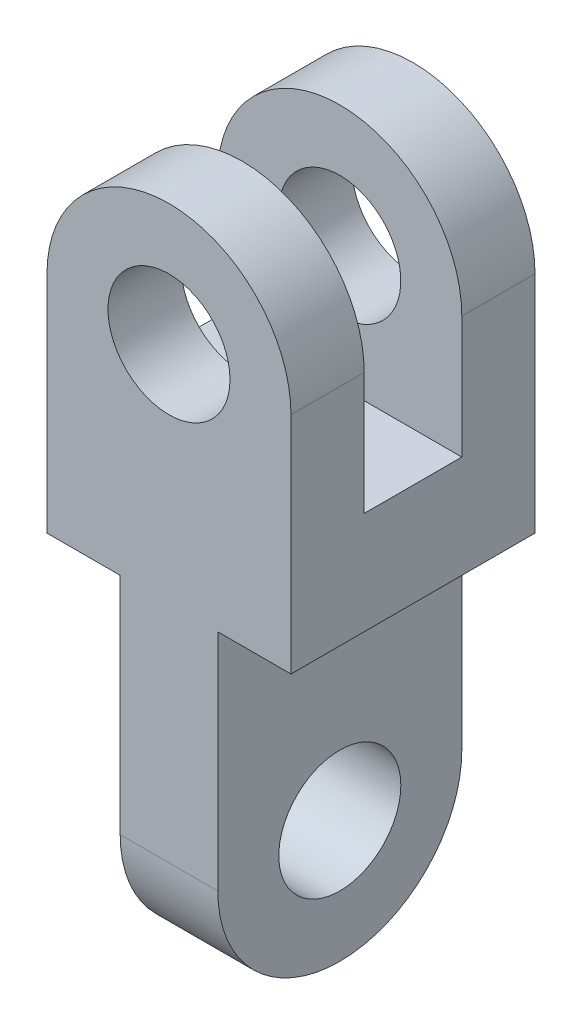
ISO-10303-21;
HEADER;
FILE_DESCRIPTION(('STEP AP214'),'2;1');
FILE_NAME('part.step','',(''),(''),'','','');
FILE_SCHEMA(('AUTOMOTIVE_DESIGN { 1 0 10303 214 1 1 1 1 }'));
ENDSEC;
DATA;
#1=APPLICATION_CONTEXT('core data for automotive mechanical design processes');
#2=APPLICATION_PROTOCOL_DEFINITION('international standard','automotive_design',2000,#1);
#3=PRODUCT_CONTEXT('',#1,'mechanical');
#4=PRODUCT('Part','Part','',(#3));
#5=PRODUCT_RELATED_PRODUCT_CATEGORY('part','',(#4));
#6=PRODUCT_DEFINITION_FORMATION('','',#4);
#7=PRODUCT_DEFINITION_CONTEXT('part definition',#1,'design');
#8=PRODUCT_DEFINITION('design','',#6,#7);
#9=PRODUCT_DEFINITION_SHAPE('','',#8);
#10=(LENGTH_UNIT() NAMED_UNIT(*) SI_UNIT(.MILLI.,.METRE.));
#11=(NAMED_UNIT(*) PLANE_ANGLE_UNIT() SI_UNIT($,.RADIAN.));
#12=(NAMED_UNIT(*) SI_UNIT($,.STERADIAN.) SOLID_ANGLE_UNIT());
#13=UNCERTAINTY_MEASURE_WITH_UNIT(LENGTH_MEASURE(1.E-05),#10,'distance_accuracy_value','');
#14=(GEOMETRIC_REPRESENTATION_CONTEXT(3) GLOBAL_UNCERTAINTY_ASSIGNED_CONTEXT((#13)) GLOBAL_UNIT_ASSIGNED_CONTEXT((#10,
#11,#12)) REPRESENTATION_CONTEXT('',''));
#15=CARTESIAN_POINT('',(0.,0.,0.));
#16=DIRECTION('',(0.,0.,1.));
#17=DIRECTION('',(1.,0.,0.));
#18=AXIS2_PLACEMENT_3D('',#15,#16,#17);
#19=CARTESIAN_POINT('',(0.,-92.,-30.));
#20=DIRECTION('',(0.,-1.,0.));
#21=DIRECTION('',(0.,0.,-1.));
#22=AXIS2_PLACEMENT_3D('',#19,#20,#21);
#23=PLANE('',#22);
#24=DIRECTION('',(-1.,0.,0.));
#25=VECTOR('',#24,1.);
#26=CARTESIAN_POINT('',(50.,-92.,-100.));
#27=LINE('',#26,#25);
#28=CARTESIAN_POINT('',(-20.,-92.,-100.));
#29=VERTEX_POINT('',#28);
#30=CARTESIAN_POINT('',(-50.,-92.,-100.));
#31=VERTEX_POINT('',#30);
#32=EDGE_CURVE('E188',#29,#31,#27,.T.);
#33=ORIENTED_EDGE('',*,*,#32,.F.);
#34=DIRECTION('',(0.,0.,1.));
#35=VECTOR('',#34,1.);
#36=CARTESIAN_POINT('',(-20.,-92.,0.));
#37=LINE('',#36,#35);
#38=CARTESIAN_POINT('',(-20.,-92.,0.));
#39=VERTEX_POINT('',#38);
#40=EDGE_CURVE('E172',#29,#39,#37,.T.);
#41=ORIENTED_EDGE('',*,*,#40,.T.);
#42=DIRECTION('',(1.,0.,0.));
#43=VECTOR('',#42,1.);
#44=CARTESIAN_POINT('',(0.,-92.,0.));
#45=LINE('',#44,#43);
#46=CARTESIAN_POINT('',(-50.,-92.,0.));
#47=VERTEX_POINT('',#46);
#48=EDGE_CURVE('E219',#47,#39,#45,.T.);
#49=ORIENTED_EDGE('',*,*,#48,.F.);
#50=DIRECTION('',(0.,0.,1.));
#51=VECTOR('',#50,1.);
#52=CARTESIAN_POINT('',(-50.,-92.,-30.));
#53=LINE('',#52,#51);
#54=EDGE_CURVE('E47',#31,#47,#53,.T.);
#55=ORIENTED_EDGE('',*,*,#54,.F.);
#56=EDGE_LOOP('',(#33,#41,#49,#55));
#57=FACE_BOUND('',#56,.T.);
#58=ADVANCED_FACE('F38',(#57),#23,.T.);
#59=CARTESIAN_POINT('',(0.,0.,-30.));
#60=DIRECTION('',(0.,0.,1.));
#61=DIRECTION('',(1.,0.,0.));
#62=AXIS2_PLACEMENT_3D('',#59,#60,#61);
#63=PLANE('',#62);
#64=CARTESIAN_POINT('',(0.,0.,-30.));
#65=DIRECTION('',(0.,0.,1.));
#66=DIRECTION('',(1.,0.,0.));
#67=AXIS2_PLACEMENT_3D('',#64,#65,#66);
#68=CIRCLE('',#67,25.);
#69=CARTESIAN_POINT('',(25.,0.,-30.));
#70=VERTEX_POINT('',#69);
#71=EDGE_CURVE('E215',#70,#70,#68,.T.);
#72=ORIENTED_EDGE('',*,*,#71,.T.);
#73=EDGE_LOOP('',(#72));
#74=FACE_BOUND('',#73,.T.);
#75=DIRECTION('',(1.,0.,0.));
#76=VECTOR('',#75,1.);
#77=CARTESIAN_POINT('',(50.,-50.,-30.));
#78=LINE('',#77,#76);
#79=CARTESIAN_POINT('',(-50.,-50.,-30.));
#80=VERTEX_POINT('',#79);
#81=CARTESIAN_POINT('',(50.,-50.,-30.));
#82=VERTEX_POINT('',#81);
#83=EDGE_CURVE('E63',#80,#82,#78,.T.);
#84=ORIENTED_EDGE('',*,*,#83,.F.);
#85=DIRECTION('',(0.,-1.,0.));
#86=VECTOR('',#85,1.);
#87=CARTESIAN_POINT('',(-50.,0.,-30.));
#88=LINE('',#87,#86);
#89=CARTESIAN_POINT('',(-50.,0.,-30.));
#90=VERTEX_POINT('',#89);
#91=EDGE_CURVE('E224',#90,#80,#88,.T.);
#92=ORIENTED_EDGE('',*,*,#91,.F.);
#93=CARTESIAN_POINT('',(0.,0.,-30.));
#94=DIRECTION('',(0.,0.,1.));
#95=DIRECTION('',(1.,0.,0.));
#96=AXIS2_PLACEMENT_3D('',#93,#94,#95);
#97=CIRCLE('',#96,50.);
#98=CARTESIAN_POINT('',(50.,0.,-30.));
#99=VERTEX_POINT('',#98);
#100=EDGE_CURVE('E221',#99,#90,#97,.T.);
#101=ORIENTED_EDGE('',*,*,#100,.F.);
#102=DIRECTION('',(0.,1.,0.));
#103=VECTOR('',#102,1.);
#104=CARTESIAN_POINT('',(50.,0.,-30.));
#105=LINE('',#104,#103);
#106=EDGE_CURVE('E218',#82,#99,#105,.T.);
#107=ORIENTED_EDGE('',*,*,#106,.F.);
#108=EDGE_LOOP('',(#84,#92,#101,#107));
#109=FACE_BOUND('',#108,.T.);
#110=ADVANCED_FACE('F270',(#74,#109),#63,.F.);
#111=CARTESIAN_POINT('',(50.,0.,-30.));
#112=DIRECTION('',(1.,0.,0.));
#113=DIRECTION('',(0.,1.,0.));
#114=AXIS2_PLACEMENT_3D('',#111,#112,#113);
#115=PLANE('',#114);
#116=DIRECTION('',(0.,1.,0.));
#117=VECTOR('',#116,1.);
#118=CARTESIAN_POINT('',(50.,0.,0.));
#119=LINE('',#118,#117);
#120=CARTESIAN_POINT('',(50.,-92.,0.));
#121=VERTEX_POINT('',#120);
#122=CARTESIAN_POINT('',(50.,0.,0.));
#123=VERTEX_POINT('',#122);
#124=EDGE_CURVE('E228',#121,#123,#119,.T.);
#125=ORIENTED_EDGE('',*,*,#124,.F.);
#126=DIRECTION('',(0.,0.,1.));
#127=VECTOR('',#126,1.);
#128=CARTESIAN_POINT('',(50.,-92.,-30.));
#129=LINE('',#128,#127);
#130=CARTESIAN_POINT('',(50.,-92.,-100.));
#131=VERTEX_POINT('',#130);
#132=EDGE_CURVE('E11',#131,#121,#129,.T.);
#133=ORIENTED_EDGE('',*,*,#132,.F.);
#134=DIRECTION('',(0.,-1.,0.));
#135=VECTOR('',#134,1.);
#136=CARTESIAN_POINT('',(50.,0.,-100.));
#137=LINE('',#136,#135);
#138=CARTESIAN_POINT('',(50.,0.,-100.));
#139=VERTEX_POINT('',#138);
#140=EDGE_CURVE('E185',#139,#131,#137,.T.);
#141=ORIENTED_EDGE('',*,*,#140,.F.);
#142=DIRECTION('',(0.,0.,1.));
#143=VECTOR('',#142,1.);
#144=CARTESIAN_POINT('',(50.,0.,-100.));
#145=LINE('',#144,#143);
#146=CARTESIAN_POINT('',(50.,0.,-70.));
#147=VERTEX_POINT('',#146);
#148=EDGE_CURVE('E201',#139,#147,#145,.T.);
#149=ORIENTED_EDGE('',*,*,#148,.T.);
#150=DIRECTION('',(0.,-1.,0.));
#151=VECTOR('',#150,1.);
#152=CARTESIAN_POINT('',(50.,0.,-70.));
#153=LINE('',#152,#151);
#154=CARTESIAN_POINT('',(50.,-50.,-70.));
#155=VERTEX_POINT('',#154);
#156=EDGE_CURVE('E195',#147,#155,#153,.T.);
#157=ORIENTED_EDGE('',*,*,#156,.T.);
#158=DIRECTION('',(0.,0.,1.));
#159=VECTOR('',#158,1.);
#160=CARTESIAN_POINT('',(50.,-50.,-70.));
#161=LINE('',#160,#159);
#162=EDGE_CURVE('E207',#155,#82,#161,.T.);
#163=ORIENTED_EDGE('',*,*,#162,.T.);
#164=ORIENTED_EDGE('',*,*,#106,.T.);
#165=DIRECTION('',(0.,0.,1.));
#166=VECTOR('',#165,1.);
#167=CARTESIAN_POINT('',(50.,0.,-30.));
#168=LINE('',#167,#166);
#169=EDGE_CURVE('E42',#99,#123,#168,.T.);
#170=ORIENTED_EDGE('',*,*,#169,.T.);
#171=EDGE_LOOP('',(#125,#133,#141,#149,#157,#163,#164,#170));
#172=FACE_BOUND('',#171,.T.);
#173=ADVANCED_FACE('F247',(#172),#115,.T.);
#174=DIRECTION('',(0.,0.,1.));
#175=VECTOR('',#174,1.);
#176=CARTESIAN_POINT('',(20.,-92.,0.));
#177=LINE('',#176,#175);
#178=CARTESIAN_POINT('',(20.,-92.,-100.));
#179=VERTEX_POINT('',#178);
#180=CARTESIAN_POINT('',(20.,-92.,0.));
#181=VERTEX_POINT('',#180);
#182=EDGE_CURVE('E152',#179,#181,#177,.T.);
#183=ORIENTED_EDGE('',*,*,#182,.F.);
#184=EDGE_CURVE('E149',#131,#179,#27,.T.);
#185=ORIENTED_EDGE('',*,*,#184,.F.);
#186=ORIENTED_EDGE('',*,*,#132,.T.);
#187=EDGE_CURVE('E237',#181,#121,#45,.T.);
#188=ORIENTED_EDGE('',*,*,#187,.F.);
#189=EDGE_LOOP('',(#183,#185,#186,#188));
#190=FACE_BOUND('',#189,.T.);
#191=ADVANCED_FACE('F254',(#190),#23,.T.);
#192=CARTESIAN_POINT('',(-50.,0.,-30.));
#193=DIRECTION('',(-1.,0.,0.));
#194=DIRECTION('',(0.,-1.,0.));
#195=AXIS2_PLACEMENT_3D('',#192,#193,#194);
#196=PLANE('',#195);
#197=DIRECTION('',(0.,-1.,0.));
#198=VECTOR('',#197,1.);
#199=CARTESIAN_POINT('',(-50.,0.,0.));
#200=LINE('',#199,#198);
#201=CARTESIAN_POINT('',(-50.,0.,0.));
#202=VERTEX_POINT('',#201);
#203=EDGE_CURVE('E234',#202,#47,#200,.T.);
#204=ORIENTED_EDGE('',*,*,#203,.F.);
#205=DIRECTION('',(0.,0.,1.));
#206=VECTOR('',#205,1.);
#207=CARTESIAN_POINT('',(-50.,0.,-30.));
#208=LINE('',#207,#206);
#209=EDGE_CURVE('E240',#90,#202,#208,.T.);
#210=ORIENTED_EDGE('',*,*,#209,.F.);
#211=ORIENTED_EDGE('',*,*,#91,.T.);
#212=DIRECTION('',(0.,0.,1.));
#213=VECTOR('',#212,1.);
#214=CARTESIAN_POINT('',(-50.,-50.,-70.));
#215=LINE('',#214,#213);
#216=CARTESIAN_POINT('',(-50.,-50.,-70.));
#217=VERTEX_POINT('',#216);
#218=EDGE_CURVE('E211',#217,#80,#215,.T.);
#219=ORIENTED_EDGE('',*,*,#218,.F.);
#220=DIRECTION('',(0.,1.,0.));
#221=VECTOR('',#220,1.);
#222=CARTESIAN_POINT('',(-50.,-92.,-70.));
#223=LINE('',#222,#221);
#224=CARTESIAN_POINT('',(-50.,0.,-70.));
#225=VERTEX_POINT('',#224);
#226=EDGE_CURVE('E186',#217,#225,#223,.T.);
#227=ORIENTED_EDGE('',*,*,#226,.T.);
#228=DIRECTION('',(0.,0.,1.));
#229=VECTOR('',#228,1.);
#230=CARTESIAN_POINT('',(-50.,0.,-100.));
#231=LINE('',#230,#229);
#232=CARTESIAN_POINT('',(-50.,0.,-100.));
#233=VERTEX_POINT('',#232);
#234=EDGE_CURVE('E192',#233,#225,#231,.T.);
#235=ORIENTED_EDGE('',*,*,#234,.F.);
#236=DIRECTION('',(0.,1.,0.));
#237=VECTOR('',#236,1.);
#238=CARTESIAN_POINT('',(-50.,-92.,-100.));
#239=LINE('',#238,#237);
#240=EDGE_CURVE('E190',#31,#233,#239,.T.);
#241=ORIENTED_EDGE('',*,*,#240,.F.);
#242=ORIENTED_EDGE('',*,*,#54,.T.);
#243=EDGE_LOOP('',(#204,#210,#211,#219,#227,#235,#241,#242));
#244=FACE_BOUND('',#243,.T.);
#245=ADVANCED_FACE('F269',(#244),#196,.T.);
#246=CARTESIAN_POINT('',(0.,0.,-30.));
#247=DIRECTION('',(0.,0.,1.));
#248=DIRECTION('',(1.,0.,0.));
#249=AXIS2_PLACEMENT_3D('',#246,#247,#248);
#250=CYLINDRICAL_SURFACE('',#249,25.);
#251=ORIENTED_EDGE('',*,*,#71,.F.);
#252=EDGE_LOOP('',(#251));
#253=FACE_BOUND('',#252,.T.);
#254=CARTESIAN_POINT('',(0.,0.,0.));
#255=DIRECTION('',(0.,0.,1.));
#256=DIRECTION('',(1.,0.,0.));
#257=AXIS2_PLACEMENT_3D('',#254,#255,#256);
#258=CIRCLE('',#257,25.);
#259=CARTESIAN_POINT('',(25.,0.,0.));
#260=VERTEX_POINT('',#259);
#261=EDGE_CURVE('E214',#260,#260,#258,.T.);
#262=ORIENTED_EDGE('',*,*,#261,.T.);
#263=EDGE_LOOP('',(#262));
#264=FACE_BOUND('',#263,.T.);
#265=ADVANCED_FACE('F40',(#253,#264),#250,.F.);
#266=CARTESIAN_POINT('',(0.,0.,-30.));
#267=DIRECTION('',(0.,0.,1.));
#268=DIRECTION('',(1.,0.,0.));
#269=AXIS2_PLACEMENT_3D('',#266,#267,#268);
#270=CYLINDRICAL_SURFACE('',#269,50.);
#271=CARTESIAN_POINT('',(0.,0.,0.));
#272=DIRECTION('',(0.,0.,1.));
#273=DIRECTION('',(1.,0.,0.));
#274=AXIS2_PLACEMENT_3D('',#271,#272,#273);
#275=CIRCLE('',#274,50.);
#276=EDGE_CURVE('E231',#123,#202,#275,.T.);
#277=ORIENTED_EDGE('',*,*,#276,.F.);
#278=ORIENTED_EDGE('',*,*,#169,.F.);
#279=ORIENTED_EDGE('',*,*,#100,.T.);
#280=ORIENTED_EDGE('',*,*,#209,.T.);
#281=EDGE_LOOP('',(#277,#278,#279,#280));
#282=FACE_BOUND('',#281,.T.);
#283=ADVANCED_FACE('F249',(#282),#270,.T.);
#284=CARTESIAN_POINT('',(0.,0.,0.));
#285=DIRECTION('',(0.,0.,1.));
#286=DIRECTION('',(1.,0.,0.));
#287=AXIS2_PLACEMENT_3D('',#284,#285,#286);
#288=PLANE('',#287);
#289=ORIENTED_EDGE('',*,*,#261,.F.);
#290=EDGE_LOOP('',(#289));
#291=FACE_BOUND('',#290,.T.);
#292=ORIENTED_EDGE('',*,*,#124,.T.);
#293=ORIENTED_EDGE('',*,*,#276,.T.);
#294=ORIENTED_EDGE('',*,*,#203,.T.);
#295=ORIENTED_EDGE('',*,*,#48,.T.);
#296=DIRECTION('',(0.,-1.,0.));
#297=VECTOR('',#296,1.);
#298=CARTESIAN_POINT('',(-20.,-184.,0.));
#299=LINE('',#298,#297);
#300=CARTESIAN_POINT('',(-20.,-184.,0.));
#301=VERTEX_POINT('',#300);
#302=EDGE_CURVE('E55',#39,#301,#299,.T.);
#303=ORIENTED_EDGE('',*,*,#302,.T.);
#304=DIRECTION('',(1.,0.,0.));
#305=VECTOR('',#304,1.);
#306=CARTESIAN_POINT('',(-20.,-184.,0.));
#307=LINE('',#306,#305);
#308=CARTESIAN_POINT('',(20.,-184.,0.));
#309=VERTEX_POINT('',#308);
#310=EDGE_CURVE('E140',#301,#309,#307,.T.);
#311=ORIENTED_EDGE('',*,*,#310,.T.);
#312=DIRECTION('',(0.,-1.,0.));
#313=VECTOR('',#312,1.);
#314=CARTESIAN_POINT('',(20.,-184.,0.));
#315=LINE('',#314,#313);
#316=EDGE_CURVE('E158',#181,#309,#315,.T.);
#317=ORIENTED_EDGE('',*,*,#316,.F.);
#318=ORIENTED_EDGE('',*,*,#187,.T.);
#319=EDGE_LOOP('',(#292,#293,#294,#295,#303,#311,#317,#318));
#320=FACE_BOUND('',#319,.T.);
#321=ADVANCED_FACE('F251',(#291,#320),#288,.T.);
#322=CARTESIAN_POINT('',(50.,-50.,-70.));
#323=DIRECTION('',(0.,-1.,0.));
#324=DIRECTION('',(1.,0.,0.));
#325=AXIS2_PLACEMENT_3D('',#322,#323,#324);
#326=PLANE('',#325);
#327=ORIENTED_EDGE('',*,*,#83,.T.);
#328=ORIENTED_EDGE('',*,*,#162,.F.);
#329=DIRECTION('',(1.,0.,0.));
#330=VECTOR('',#329,1.);
#331=CARTESIAN_POINT('',(50.,-50.,-70.));
#332=LINE('',#331,#330);
#333=EDGE_CURVE('E204',#217,#155,#332,.T.);
#334=ORIENTED_EDGE('',*,*,#333,.F.);
#335=ORIENTED_EDGE('',*,*,#218,.T.);
#336=EDGE_LOOP('',(#327,#328,#334,#335));
#337=FACE_BOUND('',#336,.T.);
#338=ADVANCED_FACE('F267',(#337),#326,.F.);
#339=CARTESIAN_POINT('',(0.,0.,-70.));
#340=DIRECTION('',(0.,0.,-1.));
#341=DIRECTION('',(-1.,0.,0.));
#342=AXIS2_PLACEMENT_3D('',#339,#340,#341);
#343=PLANE('',#342);
#344=CARTESIAN_POINT('',(0.,0.,-70.));
#345=DIRECTION('',(0.,0.,-1.));
#346=DIRECTION('',(-1.,0.,0.));
#347=AXIS2_PLACEMENT_3D('',#344,#345,#346);
#348=CIRCLE('',#347,25.);
#349=CARTESIAN_POINT('',(-25.,0.,-70.));
#350=VERTEX_POINT('',#349);
#351=EDGE_CURVE('E175',#350,#350,#348,.T.);
#352=ORIENTED_EDGE('',*,*,#351,.T.);
#353=EDGE_LOOP('',(#352));
#354=FACE_BOUND('',#353,.T.);
#355=ORIENTED_EDGE('',*,*,#226,.F.);
#356=ORIENTED_EDGE('',*,*,#333,.T.);
#357=ORIENTED_EDGE('',*,*,#156,.F.);
#358=CARTESIAN_POINT('',(0.,0.,-70.));
#359=DIRECTION('',(0.,0.,-1.));
#360=DIRECTION('',(-1.,0.,0.));
#361=AXIS2_PLACEMENT_3D('',#358,#359,#360);
#362=CIRCLE('',#361,50.);
#363=EDGE_CURVE('E180',#225,#147,#362,.T.);
#364=ORIENTED_EDGE('',*,*,#363,.F.);
#365=EDGE_LOOP('',(#355,#356,#357,#364));
#366=FACE_BOUND('',#365,.T.);
#367=ADVANCED_FACE('F264',(#354,#366),#343,.F.);
#368=CARTESIAN_POINT('',(0.,0.,-100.));
#369=DIRECTION('',(0.,0.,-1.));
#370=DIRECTION('',(-1.,0.,0.));
#371=AXIS2_PLACEMENT_3D('',#368,#369,#370);
#372=PLANE('',#371);
#373=CARTESIAN_POINT('',(0.,0.,-100.));
#374=DIRECTION('',(0.,0.,-1.));
#375=DIRECTION('',(-1.,0.,0.));
#376=AXIS2_PLACEMENT_3D('',#373,#374,#375);
#377=CIRCLE('',#376,50.);
#378=EDGE_CURVE('E183',#233,#139,#377,.T.);
#379=ORIENTED_EDGE('',*,*,#378,.T.);
#380=ORIENTED_EDGE('',*,*,#140,.T.);
#381=ORIENTED_EDGE('',*,*,#184,.T.);
#382=DIRECTION('',(0.,1.,0.));
#383=VECTOR('',#382,1.);
#384=CARTESIAN_POINT('',(20.,-184.,-100.));
#385=LINE('',#384,#383);
#386=CARTESIAN_POINT('',(20.,-184.,-100.));
#387=VERTEX_POINT('',#386);
#388=EDGE_CURVE('E143',#387,#179,#385,.T.);
#389=ORIENTED_EDGE('',*,*,#388,.F.);
#390=DIRECTION('',(1.,0.,0.));
#391=VECTOR('',#390,1.);
#392=CARTESIAN_POINT('',(-20.,-184.,-100.));
#393=LINE('',#392,#391);
#394=CARTESIAN_POINT('',(-20.,-184.,-100.));
#395=VERTEX_POINT('',#394);
#396=EDGE_CURVE('E131',#395,#387,#393,.T.);
#397=ORIENTED_EDGE('',*,*,#396,.F.);
#398=DIRECTION('',(0.,1.,0.));
#399=VECTOR('',#398,1.);
#400=CARTESIAN_POINT('',(-20.,-184.,-100.));
#401=LINE('',#400,#399);
#402=EDGE_CURVE('E170',#395,#29,#401,.T.);
#403=ORIENTED_EDGE('',*,*,#402,.T.);
#404=ORIENTED_EDGE('',*,*,#32,.T.);
#405=ORIENTED_EDGE('',*,*,#240,.T.);
#406=EDGE_LOOP('',(#379,#380,#381,#389,#397,#403,#404,#405));
#407=FACE_BOUND('',#406,.T.);
#408=CARTESIAN_POINT('',(0.,0.,-100.));
#409=DIRECTION('',(0.,0.,-1.));
#410=DIRECTION('',(-1.,0.,0.));
#411=AXIS2_PLACEMENT_3D('',#408,#409,#410);
#412=CIRCLE('',#411,25.);
#413=CARTESIAN_POINT('',(-25.,0.,-100.));
#414=VERTEX_POINT('',#413);
#415=EDGE_CURVE('E177',#414,#414,#412,.T.);
#416=ORIENTED_EDGE('',*,*,#415,.F.);
#417=EDGE_LOOP('',(#416));
#418=FACE_BOUND('',#417,.T.);
#419=ADVANCED_FACE('F145',(#407,#418),#372,.T.);
#420=CARTESIAN_POINT('',(0.,0.,-100.));
#421=DIRECTION('',(0.,0.,1.));
#422=DIRECTION('',(1.,0.,0.));
#423=AXIS2_PLACEMENT_3D('',#420,#421,#422);
#424=CYLINDRICAL_SURFACE('',#423,50.);
#425=ORIENTED_EDGE('',*,*,#363,.T.);
#426=ORIENTED_EDGE('',*,*,#148,.F.);
#427=ORIENTED_EDGE('',*,*,#378,.F.);
#428=ORIENTED_EDGE('',*,*,#234,.T.);
#429=EDGE_LOOP('',(#425,#426,#427,#428));
#430=FACE_BOUND('',#429,.T.);
#431=ADVANCED_FACE('F260',(#430),#424,.T.);
#432=CARTESIAN_POINT('',(0.,0.,-100.));
#433=DIRECTION('',(0.,0.,1.));
#434=DIRECTION('',(1.,0.,0.));
#435=AXIS2_PLACEMENT_3D('',#432,#433,#434);
#436=CYLINDRICAL_SURFACE('',#435,25.);
#437=ORIENTED_EDGE('',*,*,#415,.T.);
#438=EDGE_LOOP('',(#437));
#439=FACE_BOUND('',#438,.T.);
#440=ORIENTED_EDGE('',*,*,#351,.F.);
#441=EDGE_LOOP('',(#440));
#442=FACE_BOUND('',#441,.T.);
#443=ADVANCED_FACE('F367',(#439,#442),#436,.F.);
#444=CARTESIAN_POINT('',(-20.,-184.,-50.));
#445=DIRECTION('',(1.,0.,0.));
#446=DIRECTION('',(0.,0.,-1.));
#447=AXIS2_PLACEMENT_3D('',#444,#445,#446);
#448=CYLINDRICAL_SURFACE('',#447,50.);
#449=ORIENTED_EDGE('',*,*,#396,.T.);
#450=CARTESIAN_POINT('',(20.,-184.,-50.));
#451=DIRECTION('',(1.,0.,0.));
#452=DIRECTION('',(0.,0.,-1.));
#453=AXIS2_PLACEMENT_3D('',#450,#451,#452);
#454=CIRCLE('',#453,50.);
#455=EDGE_CURVE('E135',#309,#387,#454,.T.);
#456=ORIENTED_EDGE('',*,*,#455,.F.);
#457=ORIENTED_EDGE('',*,*,#310,.F.);
#458=CARTESIAN_POINT('',(-20.,-184.,-50.));
#459=DIRECTION('',(1.,0.,0.));
#460=DIRECTION('',(0.,0.,-1.));
#461=AXIS2_PLACEMENT_3D('',#458,#459,#460);
#462=CIRCLE('',#461,50.);
#463=EDGE_CURVE('E136',#301,#395,#462,.T.);
#464=ORIENTED_EDGE('',*,*,#463,.T.);
#465=EDGE_LOOP('',(#449,#456,#457,#464));
#466=FACE_BOUND('',#465,.T.);
#467=ADVANCED_FACE('F133',(#466),#448,.T.);
#468=CARTESIAN_POINT('',(-20.,-184.,-50.));
#469=DIRECTION('',(1.,0.,0.));
#470=DIRECTION('',(0.,0.,-1.));
#471=AXIS2_PLACEMENT_3D('',#468,#469,#470);
#472=PLANE('',#471);
#473=CARTESIAN_POINT('',(-20.,-184.,-50.));
#474=DIRECTION('',(1.,0.,0.));
#475=DIRECTION('',(0.,0.,-1.));
#476=AXIS2_PLACEMENT_3D('',#473,#474,#475);
#477=CIRCLE('',#476,25.);
#478=CARTESIAN_POINT('',(-20.,-184.,-75.));
#479=VERTEX_POINT('',#478);
#480=EDGE_CURVE('E166',#479,#479,#477,.T.);
#481=ORIENTED_EDGE('',*,*,#480,.T.);
#482=EDGE_LOOP('',(#481));
#483=FACE_BOUND('',#482,.T.);
#484=ORIENTED_EDGE('',*,*,#463,.F.);
#485=ORIENTED_EDGE('',*,*,#302,.F.);
#486=ORIENTED_EDGE('',*,*,#40,.F.);
#487=ORIENTED_EDGE('',*,*,#402,.F.);
#488=EDGE_LOOP('',(#484,#485,#486,#487));
#489=FACE_BOUND('',#488,.T.);
#490=ADVANCED_FACE('F366',(#483,#489),#472,.F.);
#491=CARTESIAN_POINT('',(-20.,-184.,-50.));
#492=DIRECTION('',(1.,0.,0.));
#493=DIRECTION('',(0.,0.,-1.));
#494=AXIS2_PLACEMENT_3D('',#491,#492,#493);
#495=CYLINDRICAL_SURFACE('',#494,25.);
#496=ORIENTED_EDGE('',*,*,#480,.F.);
#497=EDGE_LOOP('',(#496));
#498=FACE_BOUND('',#497,.T.);
#499=CARTESIAN_POINT('',(20.,-184.,-50.));
#500=DIRECTION('',(1.,0.,0.));
#501=DIRECTION('',(0.,0.,-1.));
#502=AXIS2_PLACEMENT_3D('',#499,#500,#501);
#503=CIRCLE('',#502,25.);
#504=CARTESIAN_POINT('',(20.,-184.,-75.));
#505=VERTEX_POINT('',#504);
#506=EDGE_CURVE('E159',#505,#505,#503,.T.);
#507=ORIENTED_EDGE('',*,*,#506,.T.);
#508=EDGE_LOOP('',(#507));
#509=FACE_BOUND('',#508,.T.);
#510=ADVANCED_FACE('F375',(#498,#509),#495,.F.);
#511=CARTESIAN_POINT('',(20.,-184.,-50.));
#512=DIRECTION('',(1.,0.,0.));
#513=DIRECTION('',(0.,0.,-1.));
#514=AXIS2_PLACEMENT_3D('',#511,#512,#513);
#515=PLANE('',#514);
#516=ORIENTED_EDGE('',*,*,#455,.T.);
#517=ORIENTED_EDGE('',*,*,#388,.T.);
#518=ORIENTED_EDGE('',*,*,#182,.T.);
#519=ORIENTED_EDGE('',*,*,#316,.T.);
#520=EDGE_LOOP('',(#516,#517,#518,#519));
#521=FACE_BOUND('',#520,.T.);
#522=ORIENTED_EDGE('',*,*,#506,.F.);
#523=EDGE_LOOP('',(#522));
#524=FACE_BOUND('',#523,.T.);
#525=ADVANCED_FACE('F155',(#521,#524),#515,.T.);
#526=CLOSED_SHELL('',(#58,#110,#173,#191,#245,#265,#283,#321,#338,#367,#419,#431,#443,#467,#490,
#510,#525));
#527=MANIFOLD_SOLID_BREP('B2',#526);
#528=ADVANCED_BREP_SHAPE_REPRESENTATION('',(#18,#527),#14);
#529=SHAPE_DEFINITION_REPRESENTATION(#9,#528);
ENDSEC;
END-ISO-10303-21;
